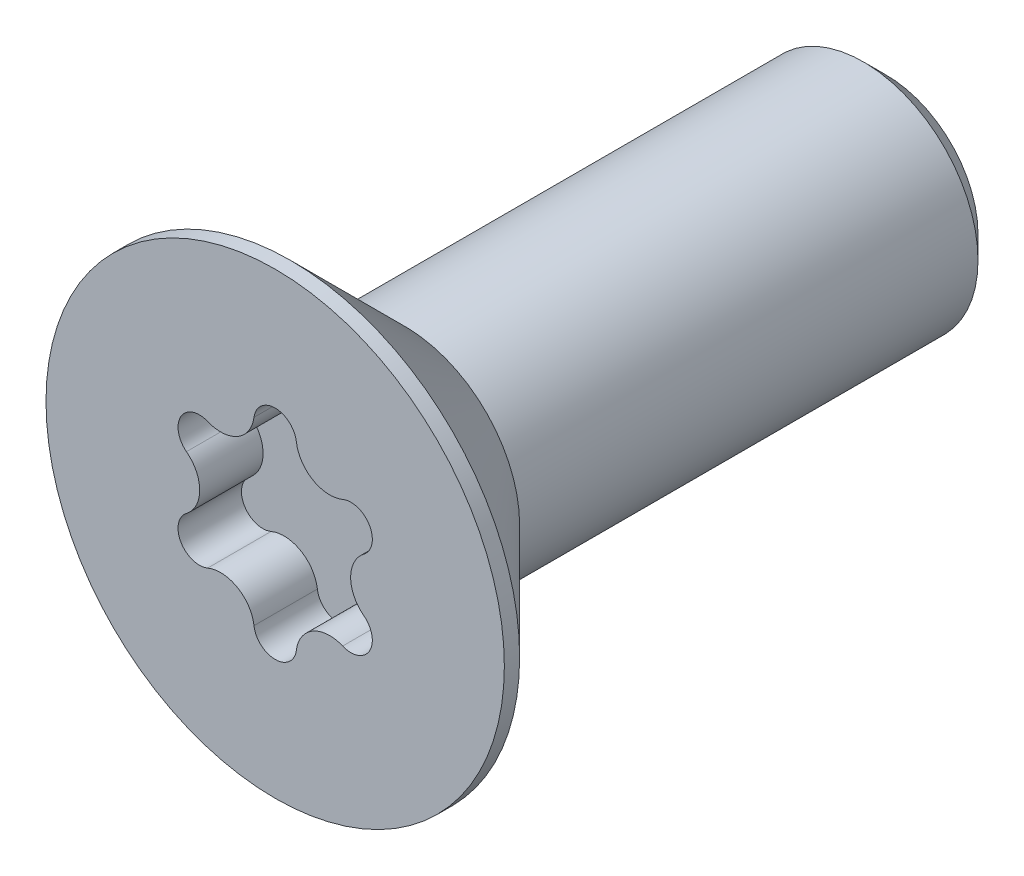
ISO-10303-21;
HEADER;
FILE_DESCRIPTION(('STEP AP214'),'2;1');
FILE_NAME('part.step','',(''),(''),'','','');
FILE_SCHEMA(('AUTOMOTIVE_DESIGN { 1 0 10303 214 1 1 1 1 }'));
ENDSEC;
DATA;
#1=APPLICATION_CONTEXT('core data for automotive mechanical design processes');
#2=APPLICATION_PROTOCOL_DEFINITION('international standard','automotive_design',2000,#1);
#3=PRODUCT_CONTEXT('',#1,'mechanical');
#4=PRODUCT('Part','Part','',(#3));
#5=PRODUCT_RELATED_PRODUCT_CATEGORY('part','',(#4));
#6=PRODUCT_DEFINITION_FORMATION('','',#4);
#7=PRODUCT_DEFINITION_CONTEXT('part definition',#1,'design');
#8=PRODUCT_DEFINITION('design','',#6,#7);
#9=PRODUCT_DEFINITION_SHAPE('','',#8);
#10=(LENGTH_UNIT() NAMED_UNIT(*) SI_UNIT(.MILLI.,.METRE.));
#11=(NAMED_UNIT(*) PLANE_ANGLE_UNIT() SI_UNIT($,.RADIAN.));
#12=(NAMED_UNIT(*) SI_UNIT($,.STERADIAN.) SOLID_ANGLE_UNIT());
#13=UNCERTAINTY_MEASURE_WITH_UNIT(LENGTH_MEASURE(1.E-05),#10,'distance_accuracy_value','');
#14=(GEOMETRIC_REPRESENTATION_CONTEXT(3) GLOBAL_UNCERTAINTY_ASSIGNED_CONTEXT((#13)) GLOBAL_UNIT_ASSIGNED_CONTEXT((#10,
#11,#12)) REPRESENTATION_CONTEXT('',''));
#15=CARTESIAN_POINT('',(0.,0.,0.));
#16=DIRECTION('',(0.,0.,1.));
#17=DIRECTION('',(1.,0.,0.));
#18=AXIS2_PLACEMENT_3D('',#15,#16,#17);
#19=CARTESIAN_POINT('',(0.,0.,1.7));
#20=DIRECTION('',(0.,0.,1.));
#21=DIRECTION('',(1.,0.,0.));
#22=AXIS2_PLACEMENT_3D('',#19,#20,#21);
#23=PLANE('',#22);
#24=CARTESIAN_POINT('',(0.,0.,1.7));
#25=DIRECTION('',(0.,0.,1.));
#26=DIRECTION('',(1.,0.,0.));
#27=AXIS2_PLACEMENT_3D('',#24,#25,#26);
#28=CIRCLE('',#27,3.);
#29=CARTESIAN_POINT('',(3.,0.,1.7));
#30=VERTEX_POINT('',#29);
#31=EDGE_CURVE('E10',#30,#30,#28,.T.);
#32=ORIENTED_EDGE('',*,*,#31,.T.);
#33=EDGE_LOOP('',(#32));
#34=FACE_BOUND('',#33,.T.);
#35=CARTESIAN_POINT('',(0.,-1.145,1.7));
#36=DIRECTION('',(0.,0.,-1.));
#37=DIRECTION('',(1.,0.,0.));
#38=AXIS2_PLACEMENT_3D('',#35,#36,#37);
#39=CIRCLE('',#38,0.28);
#40=CARTESIAN_POINT('',(0.277710764558,-1.180731376246,1.7));
#41=VERTEX_POINT('',#40);
#42=CARTESIAN_POINT('',(-0.277710764558,-1.180731376246,1.7));
#43=VERTEX_POINT('',#42);
#44=EDGE_CURVE('E26',#41,#43,#39,.T.);
#45=ORIENTED_EDGE('',*,*,#44,.T.);
#46=CARTESIAN_POINT('',(-0.714113394579,-1.236880681775,1.7));
#47=DIRECTION('',(0.,0.,1.));
#48=DIRECTION('',(1.,0.,0.));
#49=AXIS2_PLACEMENT_3D('',#46,#47,#48);
#50=CIRCLE('',#49,0.44);
#51=CARTESIAN_POINT('',(-0.883687984595,-0.830870265135,1.7));
#52=VERTEX_POINT('',#51);
#53=EDGE_CURVE('E180',#43,#52,#50,.T.);
#54=ORIENTED_EDGE('',*,*,#53,.T.);
#55=CARTESIAN_POINT('',(-0.991599087333,-0.5725,1.7));
#56=DIRECTION('',(0.,0.,-1.));
#57=DIRECTION('',(1.,0.,0.));
#58=AXIS2_PLACEMENT_3D('',#55,#56,#57);
#59=CIRCLE('',#58,0.28);
#60=CARTESIAN_POINT('',(-1.161398749154,-0.349861111111,1.7));
#61=VERTEX_POINT('',#60);
#62=EDGE_CURVE('E184',#52,#61,#59,.T.);
#63=ORIENTED_EDGE('',*,*,#62,.T.);
#64=CARTESIAN_POINT('',(-1.428226789157,0.,1.7));
#65=DIRECTION('',(0.,0.,1.));
#66=DIRECTION('',(1.,0.,0.));
#67=AXIS2_PLACEMENT_3D('',#64,#65,#66);
#68=CIRCLE('',#67,0.44);
#69=CARTESIAN_POINT('',(-1.161398749154,0.349861111111,1.7));
#70=VERTEX_POINT('',#69);
#71=EDGE_CURVE('E225',#61,#70,#68,.T.);
#72=ORIENTED_EDGE('',*,*,#71,.T.);
#73=CARTESIAN_POINT('',(-0.991599087333,0.5725,1.7));
#74=DIRECTION('',(0.,0.,-1.));
#75=DIRECTION('',(1.,0.,0.));
#76=AXIS2_PLACEMENT_3D('',#73,#74,#75);
#77=CIRCLE('',#76,0.28);
#78=CARTESIAN_POINT('',(-0.883687984595,0.830870265135,1.7));
#79=VERTEX_POINT('',#78);
#80=EDGE_CURVE('E238',#70,#79,#77,.T.);
#81=ORIENTED_EDGE('',*,*,#80,.T.);
#82=CARTESIAN_POINT('',(-0.714113394579,1.236880681775,1.7));
#83=DIRECTION('',(0.,0.,1.));
#84=DIRECTION('',(1.,0.,0.));
#85=AXIS2_PLACEMENT_3D('',#82,#83,#84);
#86=CIRCLE('',#85,0.44);
#87=CARTESIAN_POINT('',(-0.277710764558,1.180731376246,1.7));
#88=VERTEX_POINT('',#87);
#89=EDGE_CURVE('E242',#79,#88,#86,.T.);
#90=ORIENTED_EDGE('',*,*,#89,.T.);
#91=CARTESIAN_POINT('',(0.,1.145,1.7));
#92=DIRECTION('',(0.,0.,-1.));
#93=DIRECTION('',(1.,0.,0.));
#94=AXIS2_PLACEMENT_3D('',#91,#92,#93);
#95=CIRCLE('',#94,0.28);
#96=CARTESIAN_POINT('',(0.277710764558,1.180731376246,1.7));
#97=VERTEX_POINT('',#96);
#98=EDGE_CURVE('E239',#88,#97,#95,.T.);
#99=ORIENTED_EDGE('',*,*,#98,.T.);
#100=CARTESIAN_POINT('',(0.714113394579,1.236880681775,1.7));
#101=DIRECTION('',(0.,0.,1.));
#102=DIRECTION('',(1.,0.,0.));
#103=AXIS2_PLACEMENT_3D('',#100,#101,#102);
#104=CIRCLE('',#103,0.44);
#105=CARTESIAN_POINT('',(0.883687984595,0.830870265135,1.7));
#106=VERTEX_POINT('',#105);
#107=EDGE_CURVE('E140',#97,#106,#104,.T.);
#108=ORIENTED_EDGE('',*,*,#107,.T.);
#109=CARTESIAN_POINT('',(0.991599087333,0.5725,1.7));
#110=DIRECTION('',(0.,0.,-1.));
#111=DIRECTION('',(1.,0.,0.));
#112=AXIS2_PLACEMENT_3D('',#109,#110,#111);
#113=CIRCLE('',#112,0.28);
#114=CARTESIAN_POINT('',(1.161398749154,0.349861111111,1.7));
#115=VERTEX_POINT('',#114);
#116=EDGE_CURVE('E216',#106,#115,#113,.T.);
#117=ORIENTED_EDGE('',*,*,#116,.T.);
#118=CARTESIAN_POINT('',(1.428226789157,0.,1.7));
#119=DIRECTION('',(0.,0.,1.));
#120=DIRECTION('',(1.,0.,0.));
#121=AXIS2_PLACEMENT_3D('',#118,#119,#120);
#122=CIRCLE('',#121,0.44);
#123=CARTESIAN_POINT('',(1.161398749154,-0.349861111111,1.7));
#124=VERTEX_POINT('',#123);
#125=EDGE_CURVE('E194',#115,#124,#122,.T.);
#126=ORIENTED_EDGE('',*,*,#125,.T.);
#127=CARTESIAN_POINT('',(0.991599087333,-0.5725,1.7));
#128=DIRECTION('',(0.,0.,-1.));
#129=DIRECTION('',(1.,0.,0.));
#130=AXIS2_PLACEMENT_3D('',#127,#128,#129);
#131=CIRCLE('',#130,0.28);
#132=CARTESIAN_POINT('',(0.883687984595,-0.830870265135,1.7));
#133=VERTEX_POINT('',#132);
#134=EDGE_CURVE('E191',#124,#133,#131,.T.);
#135=ORIENTED_EDGE('',*,*,#134,.T.);
#136=CARTESIAN_POINT('',(0.714113394579,-1.236880681775,1.7));
#137=DIRECTION('',(0.,0.,1.));
#138=DIRECTION('',(1.,0.,0.));
#139=AXIS2_PLACEMENT_3D('',#136,#137,#138);
#140=CIRCLE('',#139,0.44);
#141=EDGE_CURVE('E195',#133,#41,#140,.T.);
#142=ORIENTED_EDGE('',*,*,#141,.T.);
#143=EDGE_LOOP('',(#45,#54,#63,#72,#81,#90,#99,#108,#117,#126,#135,#142));
#144=FACE_BOUND('',#143,.T.);
#145=ADVANCED_FACE('F15',(#34,#144),#23,.T.);
#146=CARTESIAN_POINT('',(0.,0.,1.7));
#147=DIRECTION('',(0.,0.,-1.));
#148=DIRECTION('',(1.,0.,0.));
#149=AXIS2_PLACEMENT_3D('',#146,#147,#148);
#150=CYLINDRICAL_SURFACE('',#149,3.);
#151=DIRECTION('',(0.,0.,-1.));
#152=VECTOR('',#151,1.);
#153=CARTESIAN_POINT('',(3.,0.,1.7));
#154=LINE('',#153,#152);
#155=CARTESIAN_POINT('',(3.,0.,1.5));
#156=VERTEX_POINT('',#155);
#157=EDGE_CURVE('E256',#30,#156,#154,.T.);
#158=ORIENTED_EDGE('',*,*,#157,.T.);
#159=CARTESIAN_POINT('',(0.,0.,1.5));
#160=DIRECTION('',(0.,0.,1.));
#161=DIRECTION('',(1.,0.,0.));
#162=AXIS2_PLACEMENT_3D('',#159,#160,#161);
#163=CIRCLE('',#162,3.);
#164=EDGE_CURVE('E229',#156,#156,#163,.T.);
#165=ORIENTED_EDGE('',*,*,#164,.T.);
#166=ORIENTED_EDGE('',*,*,#157,.F.);
#167=ORIENTED_EDGE('',*,*,#31,.F.);
#168=EDGE_LOOP('',(#158,#165,#166,#167));
#169=FACE_BOUND('',#168,.T.);
#170=ADVANCED_FACE('F371',(#169),#150,.T.);
#171=CARTESIAN_POINT('',(0.714113394579,-1.236880681775,0.87));
#172=DIRECTION('',(0.,0.,-1.));
#173=DIRECTION('',(1.,0.,0.));
#174=AXIS2_PLACEMENT_3D('',#171,#172,#173);
#175=CYLINDRICAL_SURFACE('',#174,0.44);
#176=CARTESIAN_POINT('',(0.714113394579,-1.236880681775,0.87));
#177=DIRECTION('',(0.,0.,1.));
#178=DIRECTION('',(1.,0.,0.));
#179=AXIS2_PLACEMENT_3D('',#176,#177,#178);
#180=CIRCLE('',#179,0.44);
#181=CARTESIAN_POINT('',(0.883687984595,-0.830870265135,0.87));
#182=VERTEX_POINT('',#181);
#183=CARTESIAN_POINT('',(0.277710764558,-1.180731376246,0.87));
#184=VERTEX_POINT('',#183);
#185=EDGE_CURVE('E189',#182,#184,#180,.T.);
#186=ORIENTED_EDGE('',*,*,#185,.T.);
#187=DIRECTION('',(0.,0.,1.));
#188=VECTOR('',#187,1.);
#189=CARTESIAN_POINT('',(0.277710764558,-1.180731376246,0.87));
#190=LINE('',#189,#188);
#191=EDGE_CURVE('E185',#184,#41,#190,.T.);
#192=ORIENTED_EDGE('',*,*,#191,.T.);
#193=ORIENTED_EDGE('',*,*,#141,.F.);
#194=DIRECTION('',(0.,0.,1.));
#195=VECTOR('',#194,1.);
#196=CARTESIAN_POINT('',(0.883687984595,-0.830870265135,0.87));
#197=LINE('',#196,#195);
#198=EDGE_CURVE('E201',#182,#133,#197,.T.);
#199=ORIENTED_EDGE('',*,*,#198,.F.);
#200=EDGE_LOOP('',(#186,#192,#193,#199));
#201=FACE_BOUND('',#200,.T.);
#202=ADVANCED_FACE('F376',(#201),#175,.T.);
#203=CARTESIAN_POINT('',(0.,-1.145,0.87));
#204=DIRECTION('',(0.,0.,-1.));
#205=DIRECTION('',(1.,0.,0.));
#206=AXIS2_PLACEMENT_3D('',#203,#204,#205);
#207=CYLINDRICAL_SURFACE('',#206,0.28);
#208=CARTESIAN_POINT('',(0.,-1.145,0.87));
#209=DIRECTION('',(0.,0.,-1.));
#210=DIRECTION('',(1.,0.,0.));
#211=AXIS2_PLACEMENT_3D('',#208,#209,#210);
#212=CIRCLE('',#211,0.28);
#213=CARTESIAN_POINT('',(-0.277710764558,-1.180731376246,0.87));
#214=VERTEX_POINT('',#213);
#215=EDGE_CURVE('E190',#184,#214,#212,.T.);
#216=ORIENTED_EDGE('',*,*,#215,.T.);
#217=DIRECTION('',(0.,0.,1.));
#218=VECTOR('',#217,1.);
#219=CARTESIAN_POINT('',(-0.277710764558,-1.180731376246,0.87));
#220=LINE('',#219,#218);
#221=EDGE_CURVE('E210',#214,#43,#220,.T.);
#222=ORIENTED_EDGE('',*,*,#221,.T.);
#223=ORIENTED_EDGE('',*,*,#44,.F.);
#224=ORIENTED_EDGE('',*,*,#191,.F.);
#225=EDGE_LOOP('',(#216,#222,#223,#224));
#226=FACE_BOUND('',#225,.T.);
#227=ADVANCED_FACE('F277',(#226),#207,.F.);
#228=CARTESIAN_POINT('',(-0.714113394579,-1.236880681775,0.87));
#229=DIRECTION('',(0.,0.,-1.));
#230=DIRECTION('',(1.,0.,0.));
#231=AXIS2_PLACEMENT_3D('',#228,#229,#230);
#232=CYLINDRICAL_SURFACE('',#231,0.44);
#233=CARTESIAN_POINT('',(-0.714113394579,-1.236880681775,0.87));
#234=DIRECTION('',(0.,0.,1.));
#235=DIRECTION('',(1.,0.,0.));
#236=AXIS2_PLACEMENT_3D('',#233,#234,#235);
#237=CIRCLE('',#236,0.44);
#238=CARTESIAN_POINT('',(-0.883687984595,-0.830870265135,0.87));
#239=VERTEX_POINT('',#238);
#240=EDGE_CURVE('E206',#214,#239,#237,.T.);
#241=ORIENTED_EDGE('',*,*,#240,.T.);
#242=DIRECTION('',(0.,0.,1.));
#243=VECTOR('',#242,1.);
#244=CARTESIAN_POINT('',(-0.883687984595,-0.830870265135,0.87));
#245=LINE('',#244,#243);
#246=EDGE_CURVE('E211',#239,#52,#245,.T.);
#247=ORIENTED_EDGE('',*,*,#246,.T.);
#248=ORIENTED_EDGE('',*,*,#53,.F.);
#249=ORIENTED_EDGE('',*,*,#221,.F.);
#250=EDGE_LOOP('',(#241,#247,#248,#249));
#251=FACE_BOUND('',#250,.T.);
#252=ADVANCED_FACE('F408',(#251),#232,.T.);
#253=CARTESIAN_POINT('',(-0.991599087333,-0.5725,0.87));
#254=DIRECTION('',(0.,0.,-1.));
#255=DIRECTION('',(1.,0.,0.));
#256=AXIS2_PLACEMENT_3D('',#253,#254,#255);
#257=CYLINDRICAL_SURFACE('',#256,0.28);
#258=CARTESIAN_POINT('',(-0.991599087333,-0.5725,0.87));
#259=DIRECTION('',(0.,0.,-1.));
#260=DIRECTION('',(1.,0.,0.));
#261=AXIS2_PLACEMENT_3D('',#258,#259,#260);
#262=CIRCLE('',#261,0.28);
#263=CARTESIAN_POINT('',(-1.161398749154,-0.349861111111,0.87));
#264=VERTEX_POINT('',#263);
#265=EDGE_CURVE('E243',#239,#264,#262,.T.);
#266=ORIENTED_EDGE('',*,*,#265,.T.);
#267=DIRECTION('',(0.,0.,1.));
#268=VECTOR('',#267,1.);
#269=CARTESIAN_POINT('',(-1.161398749154,-0.349861111111,0.87));
#270=LINE('',#269,#268);
#271=EDGE_CURVE('E247',#264,#61,#270,.T.);
#272=ORIENTED_EDGE('',*,*,#271,.T.);
#273=ORIENTED_EDGE('',*,*,#62,.F.);
#274=ORIENTED_EDGE('',*,*,#246,.F.);
#275=EDGE_LOOP('',(#266,#272,#273,#274));
#276=FACE_BOUND('',#275,.T.);
#277=ADVANCED_FACE('F413',(#276),#257,.F.);
#278=CARTESIAN_POINT('',(-1.428226789157,0.,0.87));
#279=DIRECTION('',(0.,0.,-1.));
#280=DIRECTION('',(1.,0.,0.));
#281=AXIS2_PLACEMENT_3D('',#278,#279,#280);
#282=CYLINDRICAL_SURFACE('',#281,0.44);
#283=CARTESIAN_POINT('',(-1.428226789157,0.,0.87));
#284=DIRECTION('',(0.,0.,1.));
#285=DIRECTION('',(1.,0.,0.));
#286=AXIS2_PLACEMENT_3D('',#283,#284,#285);
#287=CIRCLE('',#286,0.44);
#288=CARTESIAN_POINT('',(-1.161398749154,0.349861111111,0.87));
#289=VERTEX_POINT('',#288);
#290=EDGE_CURVE('E252',#264,#289,#287,.T.);
#291=ORIENTED_EDGE('',*,*,#290,.T.);
#292=DIRECTION('',(0.,0.,1.));
#293=VECTOR('',#292,1.);
#294=CARTESIAN_POINT('',(-1.161398749154,0.349861111111,0.87));
#295=LINE('',#294,#293);
#296=EDGE_CURVE('E251',#289,#70,#295,.T.);
#297=ORIENTED_EDGE('',*,*,#296,.T.);
#298=ORIENTED_EDGE('',*,*,#71,.F.);
#299=ORIENTED_EDGE('',*,*,#271,.F.);
#300=EDGE_LOOP('',(#291,#297,#298,#299));
#301=FACE_BOUND('',#300,.T.);
#302=ADVANCED_FACE('F364',(#301),#282,.T.);
#303=CARTESIAN_POINT('',(-0.991599087333,0.5725,0.87));
#304=DIRECTION('',(0.,0.,-1.));
#305=DIRECTION('',(1.,0.,0.));
#306=AXIS2_PLACEMENT_3D('',#303,#304,#305);
#307=CYLINDRICAL_SURFACE('',#306,0.28);
#308=CARTESIAN_POINT('',(-0.991599087333,0.5725,0.87));
#309=DIRECTION('',(0.,0.,-1.));
#310=DIRECTION('',(1.,0.,0.));
#311=AXIS2_PLACEMENT_3D('',#308,#309,#310);
#312=CIRCLE('',#311,0.28);
#313=CARTESIAN_POINT('',(-0.883687984595,0.830870265135,0.87));
#314=VERTEX_POINT('',#313);
#315=EDGE_CURVE('E234',#289,#314,#312,.T.);
#316=ORIENTED_EDGE('',*,*,#315,.T.);
#317=DIRECTION('',(0.,0.,1.));
#318=VECTOR('',#317,1.);
#319=CARTESIAN_POINT('',(-0.883687984595,0.830870265135,0.87));
#320=LINE('',#319,#318);
#321=EDGE_CURVE('E230',#314,#79,#320,.T.);
#322=ORIENTED_EDGE('',*,*,#321,.T.);
#323=ORIENTED_EDGE('',*,*,#80,.F.);
#324=ORIENTED_EDGE('',*,*,#296,.F.);
#325=EDGE_LOOP('',(#316,#322,#323,#324));
#326=FACE_BOUND('',#325,.T.);
#327=ADVANCED_FACE('F351',(#326),#307,.F.);
#328=CARTESIAN_POINT('',(-0.714113394579,1.236880681775,0.87));
#329=DIRECTION('',(0.,0.,-1.));
#330=DIRECTION('',(1.,0.,0.));
#331=AXIS2_PLACEMENT_3D('',#328,#329,#330);
#332=CYLINDRICAL_SURFACE('',#331,0.44);
#333=CARTESIAN_POINT('',(-0.714113394579,1.236880681775,0.87));
#334=DIRECTION('',(0.,0.,1.));
#335=DIRECTION('',(1.,0.,0.));
#336=AXIS2_PLACEMENT_3D('',#333,#334,#335);
#337=CIRCLE('',#336,0.44);
#338=CARTESIAN_POINT('',(-0.277710764558,1.180731376246,0.87));
#339=VERTEX_POINT('',#338);
#340=EDGE_CURVE('E170',#314,#339,#337,.T.);
#341=ORIENTED_EDGE('',*,*,#340,.T.);
#342=DIRECTION('',(0.,0.,1.));
#343=VECTOR('',#342,1.);
#344=CARTESIAN_POINT('',(-0.277710764558,1.180731376246,0.87));
#345=LINE('',#344,#343);
#346=EDGE_CURVE('E149',#339,#88,#345,.T.);
#347=ORIENTED_EDGE('',*,*,#346,.T.);
#348=ORIENTED_EDGE('',*,*,#89,.F.);
#349=ORIENTED_EDGE('',*,*,#321,.F.);
#350=EDGE_LOOP('',(#341,#347,#348,#349));
#351=FACE_BOUND('',#350,.T.);
#352=ADVANCED_FACE('F17',(#351),#332,.T.);
#353=CARTESIAN_POINT('',(0.,1.145,0.87));
#354=DIRECTION('',(0.,0.,-1.));
#355=DIRECTION('',(1.,0.,0.));
#356=AXIS2_PLACEMENT_3D('',#353,#354,#355);
#357=CYLINDRICAL_SURFACE('',#356,0.28);
#358=CARTESIAN_POINT('',(0.,1.145,0.87));
#359=DIRECTION('',(0.,0.,-1.));
#360=DIRECTION('',(1.,0.,0.));
#361=AXIS2_PLACEMENT_3D('',#358,#359,#360);
#362=CIRCLE('',#361,0.28);
#363=CARTESIAN_POINT('',(0.277710764558,1.180731376246,0.87));
#364=VERTEX_POINT('',#363);
#365=EDGE_CURVE('E144',#339,#364,#362,.T.);
#366=ORIENTED_EDGE('',*,*,#365,.T.);
#367=DIRECTION('',(0.,0.,1.));
#368=VECTOR('',#367,1.);
#369=CARTESIAN_POINT('',(0.277710764558,1.180731376246,0.87));
#370=LINE('',#369,#368);
#371=EDGE_CURVE('E132',#364,#97,#370,.T.);
#372=ORIENTED_EDGE('',*,*,#371,.T.);
#373=ORIENTED_EDGE('',*,*,#98,.F.);
#374=ORIENTED_EDGE('',*,*,#346,.F.);
#375=EDGE_LOOP('',(#366,#372,#373,#374));
#376=FACE_BOUND('',#375,.T.);
#377=ADVANCED_FACE('F147',(#376),#357,.F.);
#378=CARTESIAN_POINT('',(0.714113394579,1.236880681775,0.87));
#379=DIRECTION('',(0.,0.,-1.));
#380=DIRECTION('',(1.,0.,0.));
#381=AXIS2_PLACEMENT_3D('',#378,#379,#380);
#382=CYLINDRICAL_SURFACE('',#381,0.44);
#383=CARTESIAN_POINT('',(0.714113394579,1.236880681775,0.87));
#384=DIRECTION('',(0.,0.,1.));
#385=DIRECTION('',(1.,0.,0.));
#386=AXIS2_PLACEMENT_3D('',#383,#384,#385);
#387=CIRCLE('',#386,0.44);
#388=CARTESIAN_POINT('',(0.883687984595,0.830870265135,0.87));
#389=VERTEX_POINT('',#388);
#390=EDGE_CURVE('E137',#364,#389,#387,.T.);
#391=ORIENTED_EDGE('',*,*,#390,.T.);
#392=DIRECTION('',(0.,0.,1.));
#393=VECTOR('',#392,1.);
#394=CARTESIAN_POINT('',(0.883687984595,0.830870265135,0.87));
#395=LINE('',#394,#393);
#396=EDGE_CURVE('E161',#389,#106,#395,.T.);
#397=ORIENTED_EDGE('',*,*,#396,.T.);
#398=ORIENTED_EDGE('',*,*,#107,.F.);
#399=ORIENTED_EDGE('',*,*,#371,.F.);
#400=EDGE_LOOP('',(#391,#397,#398,#399));
#401=FACE_BOUND('',#400,.T.);
#402=ADVANCED_FACE('F134',(#401),#382,.T.);
#403=CARTESIAN_POINT('',(0.991599087333,0.5725,0.87));
#404=DIRECTION('',(0.,0.,-1.));
#405=DIRECTION('',(1.,0.,0.));
#406=AXIS2_PLACEMENT_3D('',#403,#404,#405);
#407=CYLINDRICAL_SURFACE('',#406,0.28);
#408=CARTESIAN_POINT('',(0.991599087333,0.5725,0.87));
#409=DIRECTION('',(0.,0.,-1.));
#410=DIRECTION('',(1.,0.,0.));
#411=AXIS2_PLACEMENT_3D('',#408,#409,#410);
#412=CIRCLE('',#411,0.28);
#413=CARTESIAN_POINT('',(1.161398749154,0.349861111111,0.87));
#414=VERTEX_POINT('',#413);
#415=EDGE_CURVE('E159',#389,#414,#412,.T.);
#416=ORIENTED_EDGE('',*,*,#415,.T.);
#417=DIRECTION('',(0.,0.,1.));
#418=VECTOR('',#417,1.);
#419=CARTESIAN_POINT('',(1.161398749154,0.349861111111,0.87));
#420=LINE('',#419,#418);
#421=EDGE_CURVE('E19',#414,#115,#420,.T.);
#422=ORIENTED_EDGE('',*,*,#421,.T.);
#423=ORIENTED_EDGE('',*,*,#116,.F.);
#424=ORIENTED_EDGE('',*,*,#396,.F.);
#425=EDGE_LOOP('',(#416,#422,#423,#424));
#426=FACE_BOUND('',#425,.T.);
#427=ADVANCED_FACE('F438',(#426),#407,.F.);
#428=CARTESIAN_POINT('',(1.428226789157,0.,0.87));
#429=DIRECTION('',(0.,0.,-1.));
#430=DIRECTION('',(1.,0.,0.));
#431=AXIS2_PLACEMENT_3D('',#428,#429,#430);
#432=CYLINDRICAL_SURFACE('',#431,0.44);
#433=CARTESIAN_POINT('',(1.428226789157,0.,0.87));
#434=DIRECTION('',(0.,0.,1.));
#435=DIRECTION('',(1.,0.,0.));
#436=AXIS2_PLACEMENT_3D('',#433,#434,#435);
#437=CIRCLE('',#436,0.44);
#438=CARTESIAN_POINT('',(1.161398749154,-0.349861111111,0.87));
#439=VERTEX_POINT('',#438);
#440=EDGE_CURVE('E172',#414,#439,#437,.T.);
#441=ORIENTED_EDGE('',*,*,#440,.T.);
#442=DIRECTION('',(0.,0.,1.));
#443=VECTOR('',#442,1.);
#444=CARTESIAN_POINT('',(1.161398749154,-0.349861111111,0.87));
#445=LINE('',#444,#443);
#446=EDGE_CURVE('E86',#439,#124,#445,.T.);
#447=ORIENTED_EDGE('',*,*,#446,.T.);
#448=ORIENTED_EDGE('',*,*,#125,.F.);
#449=ORIENTED_EDGE('',*,*,#421,.F.);
#450=EDGE_LOOP('',(#441,#447,#448,#449));
#451=FACE_BOUND('',#450,.T.);
#452=ADVANCED_FACE('F306',(#451),#432,.T.);
#453=CARTESIAN_POINT('',(0.991599087333,-0.5725,0.87));
#454=DIRECTION('',(0.,0.,-1.));
#455=DIRECTION('',(1.,0.,0.));
#456=AXIS2_PLACEMENT_3D('',#453,#454,#455);
#457=CYLINDRICAL_SURFACE('',#456,0.28);
#458=CARTESIAN_POINT('',(0.991599087333,-0.5725,0.87));
#459=DIRECTION('',(0.,0.,-1.));
#460=DIRECTION('',(1.,0.,0.));
#461=AXIS2_PLACEMENT_3D('',#458,#459,#460);
#462=CIRCLE('',#461,0.28);
#463=EDGE_CURVE('E205',#439,#182,#462,.T.);
#464=ORIENTED_EDGE('',*,*,#463,.T.);
#465=ORIENTED_EDGE('',*,*,#198,.T.);
#466=ORIENTED_EDGE('',*,*,#134,.F.);
#467=ORIENTED_EDGE('',*,*,#446,.F.);
#468=EDGE_LOOP('',(#464,#465,#466,#467));
#469=FACE_BOUND('',#468,.T.);
#470=ADVANCED_FACE('F308',(#469),#457,.F.);
#471=CARTESIAN_POINT('',(0.,0.,1.5));
#472=DIRECTION('',(0.,0.,1.));
#473=DIRECTION('',(1.,0.,0.));
#474=AXIS2_PLACEMENT_3D('',#471,#472,#473);
#475=CONICAL_SURFACE('',#474,3.,0.785398163397);
#476=DIRECTION('',(-0.707106781186548,0.,-0.707106781186548));
#477=VECTOR('',#476,1.);
#478=CARTESIAN_POINT('',(3.,0.,1.5));
#479=LINE('',#478,#477);
#480=CARTESIAN_POINT('',(1.5,0.,0.));
#481=VERTEX_POINT('',#480);
#482=EDGE_CURVE('E197',#156,#481,#479,.T.);
#483=ORIENTED_EDGE('',*,*,#482,.T.);
#484=CARTESIAN_POINT('',(0.,0.,0.));
#485=DIRECTION('',(0.,0.,1.));
#486=DIRECTION('',(1.,0.,0.));
#487=AXIS2_PLACEMENT_3D('',#484,#485,#486);
#488=CIRCLE('',#487,1.5);
#489=EDGE_CURVE('E99',#481,#481,#488,.T.);
#490=ORIENTED_EDGE('',*,*,#489,.T.);
#491=ORIENTED_EDGE('',*,*,#482,.F.);
#492=ORIENTED_EDGE('',*,*,#164,.F.);
#493=EDGE_LOOP('',(#483,#490,#491,#492));
#494=FACE_BOUND('',#493,.T.);
#495=ADVANCED_FACE('F471',(#494),#475,.T.);
#496=CARTESIAN_POINT('',(0.,0.,0.87));
#497=DIRECTION('',(0.,0.,1.));
#498=DIRECTION('',(1.,0.,0.));
#499=AXIS2_PLACEMENT_3D('',#496,#497,#498);
#500=PLANE('',#499);
#501=ORIENTED_EDGE('',*,*,#463,.F.);
#502=ORIENTED_EDGE('',*,*,#440,.F.);
#503=ORIENTED_EDGE('',*,*,#415,.F.);
#504=ORIENTED_EDGE('',*,*,#390,.F.);
#505=ORIENTED_EDGE('',*,*,#365,.F.);
#506=ORIENTED_EDGE('',*,*,#340,.F.);
#507=ORIENTED_EDGE('',*,*,#315,.F.);
#508=ORIENTED_EDGE('',*,*,#290,.F.);
#509=ORIENTED_EDGE('',*,*,#265,.F.);
#510=ORIENTED_EDGE('',*,*,#240,.F.);
#511=ORIENTED_EDGE('',*,*,#215,.F.);
#512=ORIENTED_EDGE('',*,*,#185,.F.);
#513=EDGE_LOOP('',(#501,#502,#503,#504,#505,#506,#507,#508,#509,#510,#511,#512));
#514=FACE_BOUND('',#513,.T.);
#515=ADVANCED_FACE('F156',(#514),#500,.T.);
#516=CARTESIAN_POINT('',(0.,0.,-6.000000000015));
#517=DIRECTION('',(0.,0.,1.));
#518=DIRECTION('',(1.,0.,0.));
#519=AXIS2_PLACEMENT_3D('',#516,#517,#518);
#520=CYLINDRICAL_SURFACE('',#519,1.5);
#521=CARTESIAN_POINT('',(0.,0.,-6.000000000015));
#522=DIRECTION('',(0.,0.,1.));
#523=DIRECTION('',(1.,0.,0.));
#524=AXIS2_PLACEMENT_3D('',#521,#522,#523);
#525=CIRCLE('',#524,1.5);
#526=CARTESIAN_POINT('',(1.5,0.,-6.000000000015));
#527=VERTEX_POINT('',#526);
#528=EDGE_CURVE('E260',#527,#527,#525,.T.);
#529=ORIENTED_EDGE('',*,*,#528,.T.);
#530=DIRECTION('',(0.,0.,1.));
#531=VECTOR('',#530,1.);
#532=CARTESIAN_POINT('',(1.5,0.,-6.000000000015));
#533=LINE('',#532,#531);
#534=EDGE_CURVE('E178',#527,#481,#533,.T.);
#535=ORIENTED_EDGE('',*,*,#534,.T.);
#536=ORIENTED_EDGE('',*,*,#489,.F.);
#537=ORIENTED_EDGE('',*,*,#534,.F.);
#538=EDGE_LOOP('',(#529,#535,#536,#537));
#539=FACE_BOUND('',#538,.T.);
#540=ADVANCED_FACE('F390',(#539),#520,.T.);
#541=CARTESIAN_POINT('',(0.,0.,-6.3));
#542=DIRECTION('',(0.,0.,1.));
#543=DIRECTION('',(1.,0.,0.));
#544=AXIS2_PLACEMENT_3D('',#541,#542,#543);
#545=CONICAL_SURFACE('',#544,1.2,0.785398163423);
#546=CARTESIAN_POINT('',(0.,0.,-6.3));
#547=DIRECTION('',(0.,0.,1.));
#548=DIRECTION('',(1.,0.,0.));
#549=AXIS2_PLACEMENT_3D('',#546,#547,#548);
#550=CIRCLE('',#549,1.2);
#551=CARTESIAN_POINT('',(1.2,0.,-6.3));
#552=VERTEX_POINT('',#551);
#553=EDGE_CURVE('E174',#552,#552,#550,.T.);
#554=ORIENTED_EDGE('',*,*,#553,.T.);
#555=DIRECTION('',(0.707106781204048,0.,0.707106781169048));
#556=VECTOR('',#555,1.);
#557=CARTESIAN_POINT('',(1.2,0.,-6.3));
#558=LINE('',#557,#556);
#559=EDGE_CURVE('E179',#552,#527,#558,.T.);
#560=ORIENTED_EDGE('',*,*,#559,.T.);
#561=ORIENTED_EDGE('',*,*,#528,.F.);
#562=ORIENTED_EDGE('',*,*,#559,.F.);
#563=EDGE_LOOP('',(#554,#560,#561,#562));
#564=FACE_BOUND('',#563,.T.);
#565=ADVANCED_FACE('F384',(#564),#545,.T.);
#566=CARTESIAN_POINT('',(0.,0.,-6.3));
#567=DIRECTION('',(0.,0.,1.));
#568=DIRECTION('',(1.,0.,0.));
#569=AXIS2_PLACEMENT_3D('',#566,#567,#568);
#570=PLANE('',#569);
#571=ORIENTED_EDGE('',*,*,#553,.F.);
#572=EDGE_LOOP('',(#571));
#573=FACE_BOUND('',#572,.T.);
#574=ADVANCED_FACE('F389',(#573),#570,.F.);
#575=CLOSED_SHELL('',(#145,#170,#202,#227,#252,#277,#302,#327,#352,#377,#402,#427,#452,#470,
#495,#515,#540,#565,#574));
#576=MANIFOLD_SOLID_BREP('B1',#575);
#577=ADVANCED_BREP_SHAPE_REPRESENTATION('',(#18,#576),#14);
#578=SHAPE_DEFINITION_REPRESENTATION(#9,#577);
ENDSEC;
END-ISO-10303-21;
